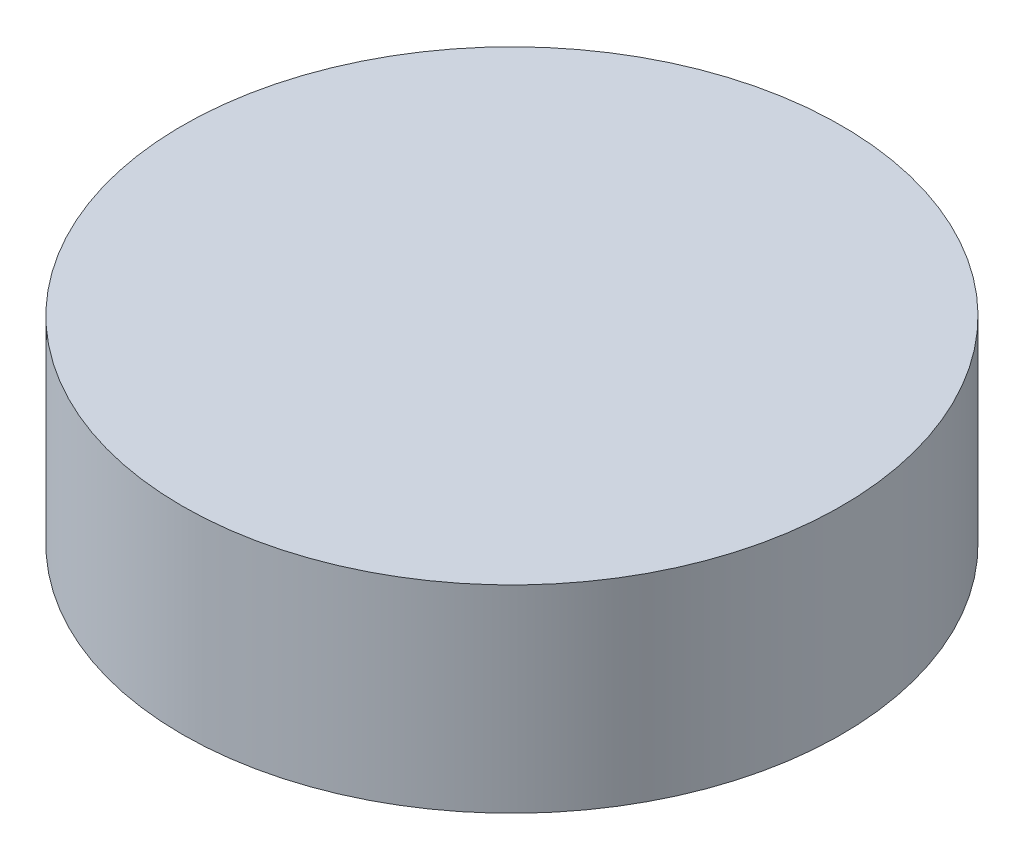
ISO-10303-21;
HEADER;
FILE_DESCRIPTION(('STEP AP214'),'2;1');
FILE_NAME('part.step','',(''),(''),'','','');
FILE_SCHEMA(('AUTOMOTIVE_DESIGN { 1 0 10303 214 1 1 1 1 }'));
ENDSEC;
DATA;
#1=APPLICATION_CONTEXT('core data for automotive mechanical design processes');
#2=APPLICATION_PROTOCOL_DEFINITION('international standard','automotive_design',2000,#1);
#3=PRODUCT_CONTEXT('',#1,'mechanical');
#4=PRODUCT('Part','Part','',(#3));
#5=PRODUCT_RELATED_PRODUCT_CATEGORY('part','',(#4));
#6=PRODUCT_DEFINITION_FORMATION('','',#4);
#7=PRODUCT_DEFINITION_CONTEXT('part definition',#1,'design');
#8=PRODUCT_DEFINITION('design','',#6,#7);
#9=PRODUCT_DEFINITION_SHAPE('','',#8);
#10=(LENGTH_UNIT() NAMED_UNIT(*) SI_UNIT(.MILLI.,.METRE.));
#11=(NAMED_UNIT(*) PLANE_ANGLE_UNIT() SI_UNIT($,.RADIAN.));
#12=(NAMED_UNIT(*) SI_UNIT($,.STERADIAN.) SOLID_ANGLE_UNIT());
#13=UNCERTAINTY_MEASURE_WITH_UNIT(LENGTH_MEASURE(1.E-05),#10,'distance_accuracy_value','');
#14=(GEOMETRIC_REPRESENTATION_CONTEXT(3) GLOBAL_UNCERTAINTY_ASSIGNED_CONTEXT((#13)) GLOBAL_UNIT_ASSIGNED_CONTEXT((#10,
#11,#12)) REPRESENTATION_CONTEXT('',''));
#15=CARTESIAN_POINT('',(0.,0.,0.));
#16=DIRECTION('',(0.,0.,1.));
#17=DIRECTION('',(1.,0.,0.));
#18=AXIS2_PLACEMENT_3D('',#15,#16,#17);
#19=CARTESIAN_POINT('',(0.,12.,0.));
#20=DIRECTION('',(0.,-1.,0.));
#21=DIRECTION('',(0.,0.,-1.));
#22=AXIS2_PLACEMENT_3D('',#19,#20,#21);
#23=CYLINDRICAL_SURFACE('',#22,20.);
#24=CARTESIAN_POINT('',(0.,12.,0.));
#25=DIRECTION('',(0.,1.,0.));
#26=DIRECTION('',(0.,0.,1.));
#27=AXIS2_PLACEMENT_3D('',#24,#25,#26);
#28=CIRCLE('',#27,20.);
#29=CARTESIAN_POINT('',(0.,12.,20.));
#30=VERTEX_POINT('',#29);
#31=EDGE_CURVE('E10',#30,#30,#28,.T.);
#32=ORIENTED_EDGE('',*,*,#31,.F.);
#33=EDGE_LOOP('',(#32));
#34=FACE_BOUND('',#33,.T.);
#35=CARTESIAN_POINT('',(0.,0.,0.));
#36=DIRECTION('',(0.,1.,0.));
#37=DIRECTION('',(0.,0.,1.));
#38=AXIS2_PLACEMENT_3D('',#35,#36,#37);
#39=CIRCLE('',#38,20.);
#40=CARTESIAN_POINT('',(0.,0.,20.));
#41=VERTEX_POINT('',#40);
#42=EDGE_CURVE('E36',#41,#41,#39,.T.);
#43=ORIENTED_EDGE('',*,*,#42,.T.);
#44=EDGE_LOOP('',(#43));
#45=FACE_BOUND('',#44,.T.);
#46=ADVANCED_FACE('F33',(#34,#45),#23,.T.);
#47=CARTESIAN_POINT('',(0.,12.,0.));
#48=DIRECTION('',(0.,1.,0.));
#49=DIRECTION('',(0.,0.,1.));
#50=AXIS2_PLACEMENT_3D('',#47,#48,#49);
#51=PLANE('',#50);
#52=ORIENTED_EDGE('',*,*,#31,.T.);
#53=EDGE_LOOP('',(#52));
#54=FACE_BOUND('',#53,.T.);
#55=ADVANCED_FACE('F48',(#54),#51,.T.);
#56=CARTESIAN_POINT('',(0.,0.,0.));
#57=DIRECTION('',(0.,1.,0.));
#58=DIRECTION('',(0.,0.,1.));
#59=AXIS2_PLACEMENT_3D('',#56,#57,#58);
#60=PLANE('',#59);
#61=ORIENTED_EDGE('',*,*,#42,.F.);
#62=EDGE_LOOP('',(#61));
#63=FACE_BOUND('',#62,.T.);
#64=ADVANCED_FACE('F46',(#63),#60,.F.);
#65=CLOSED_SHELL('',(#46,#55,#64));
#66=MANIFOLD_SOLID_BREP('B2',#65);
#67=ADVANCED_BREP_SHAPE_REPRESENTATION('',(#18,#66),#14);
#68=SHAPE_DEFINITION_REPRESENTATION(#9,#67);
ENDSEC;
END-ISO-10303-21;
